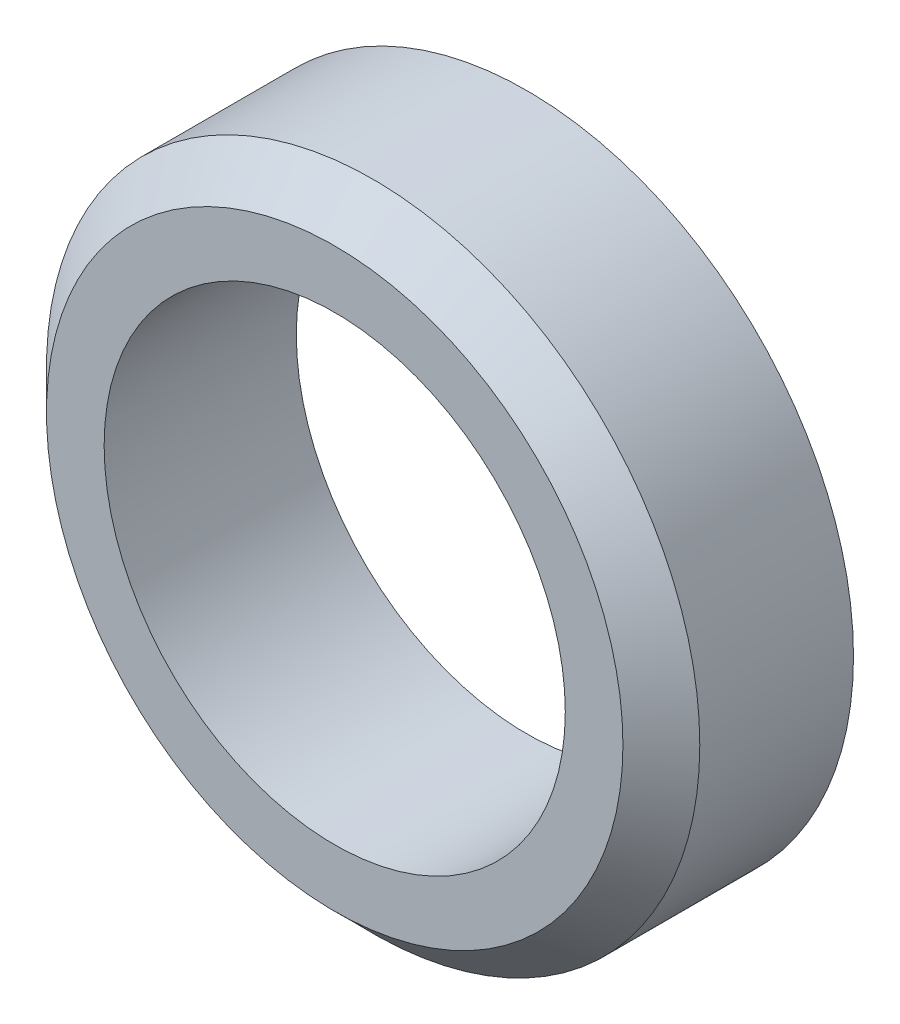
ISO-10303-21;
HEADER;
FILE_DESCRIPTION(('STEP AP214'),'2;1');
FILE_NAME('part.step','',(''),(''),'','','');
FILE_SCHEMA(('AUTOMOTIVE_DESIGN { 1 0 10303 214 1 1 1 1 }'));
ENDSEC;
DATA;
#1=APPLICATION_CONTEXT('core data for automotive mechanical design processes');
#2=APPLICATION_PROTOCOL_DEFINITION('international standard','automotive_design',2000,#1);
#3=PRODUCT_CONTEXT('',#1,'mechanical');
#4=PRODUCT('Part','Part','',(#3));
#5=PRODUCT_RELATED_PRODUCT_CATEGORY('part','',(#4));
#6=PRODUCT_DEFINITION_FORMATION('','',#4);
#7=PRODUCT_DEFINITION_CONTEXT('part definition',#1,'design');
#8=PRODUCT_DEFINITION('design','',#6,#7);
#9=PRODUCT_DEFINITION_SHAPE('','',#8);
#10=(LENGTH_UNIT() NAMED_UNIT(*) SI_UNIT(.MILLI.,.METRE.));
#11=(NAMED_UNIT(*) PLANE_ANGLE_UNIT() SI_UNIT($,.RADIAN.));
#12=(NAMED_UNIT(*) SI_UNIT($,.STERADIAN.) SOLID_ANGLE_UNIT());
#13=UNCERTAINTY_MEASURE_WITH_UNIT(LENGTH_MEASURE(1.E-05),#10,'distance_accuracy_value','');
#14=(GEOMETRIC_REPRESENTATION_CONTEXT(3) GLOBAL_UNCERTAINTY_ASSIGNED_CONTEXT((#13)) GLOBAL_UNIT_ASSIGNED_CONTEXT((#10,
#11,#12)) REPRESENTATION_CONTEXT('',''));
#15=CARTESIAN_POINT('',(0.,0.,0.));
#16=DIRECTION('',(0.,0.,1.));
#17=DIRECTION('',(1.,0.,0.));
#18=AXIS2_PLACEMENT_3D('',#15,#16,#17);
#19=CARTESIAN_POINT('',(0.,0.,25.));
#20=DIRECTION('',(0.,0.,-1.));
#21=DIRECTION('',(-1.,0.,0.));
#22=AXIS2_PLACEMENT_3D('',#19,#20,#21);
#23=CYLINDRICAL_SURFACE('',#22,42.5);
#24=CARTESIAN_POINT('',(0.,0.,20.));
#25=DIRECTION('',(0.,0.,1.));
#26=DIRECTION('',(1.,0.,0.));
#27=AXIS2_PLACEMENT_3D('',#24,#25,#26);
#28=CIRCLE('',#27,42.5);
#29=CARTESIAN_POINT('',(42.5,0.,20.));
#30=VERTEX_POINT('',#29);
#31=EDGE_CURVE('E10',#30,#30,#28,.F.);
#32=ORIENTED_EDGE('',*,*,#31,.T.);
#33=EDGE_LOOP('',(#32));
#34=FACE_BOUND('',#33,.T.);
#35=CARTESIAN_POINT('',(0.,0.,0.));
#36=DIRECTION('',(0.,0.,1.));
#37=DIRECTION('',(1.,0.,0.));
#38=AXIS2_PLACEMENT_3D('',#35,#36,#37);
#39=CIRCLE('',#38,42.5);
#40=CARTESIAN_POINT('',(42.5,0.,0.));
#41=VERTEX_POINT('',#40);
#42=EDGE_CURVE('E44',#41,#41,#39,.T.);
#43=ORIENTED_EDGE('',*,*,#42,.T.);
#44=EDGE_LOOP('',(#43));
#45=FACE_BOUND('',#44,.T.);
#46=ADVANCED_FACE('F33',(#34,#45),#23,.T.);
#47=CARTESIAN_POINT('',(0.,0.,25.));
#48=DIRECTION('',(0.,0.,1.));
#49=DIRECTION('',(1.,0.,0.));
#50=AXIS2_PLACEMENT_3D('',#47,#48,#49);
#51=PLANE('',#50);
#52=CARTESIAN_POINT('',(0.,0.,25.));
#53=DIRECTION('',(0.,0.,-1.));
#54=DIRECTION('',(-1.,0.,0.));
#55=AXIS2_PLACEMENT_3D('',#52,#53,#54);
#56=CIRCLE('',#55,30.);
#57=CARTESIAN_POINT('',(-30.,0.,25.));
#58=VERTEX_POINT('',#57);
#59=EDGE_CURVE('E48',#58,#58,#56,.T.);
#60=ORIENTED_EDGE('',*,*,#59,.T.);
#61=EDGE_LOOP('',(#60));
#62=FACE_BOUND('',#61,.T.);
#63=CARTESIAN_POINT('',(0.,0.,25.));
#64=DIRECTION('',(0.,0.,1.));
#65=DIRECTION('',(1.,0.,0.));
#66=AXIS2_PLACEMENT_3D('',#63,#64,#65);
#67=CIRCLE('',#66,37.5);
#68=CARTESIAN_POINT('',(37.5,0.,25.));
#69=VERTEX_POINT('',#68);
#70=EDGE_CURVE('E40',#69,#69,#67,.T.);
#71=ORIENTED_EDGE('',*,*,#70,.T.);
#72=EDGE_LOOP('',(#71));
#73=FACE_BOUND('',#72,.T.);
#74=ADVANCED_FACE('F57',(#62,#73),#51,.T.);
#75=CARTESIAN_POINT('',(0.,0.,0.));
#76=DIRECTION('',(0.,0.,1.));
#77=DIRECTION('',(1.,0.,0.));
#78=AXIS2_PLACEMENT_3D('',#75,#76,#77);
#79=PLANE('',#78);
#80=CARTESIAN_POINT('',(0.,0.,0.));
#81=DIRECTION('',(0.,0.,-1.));
#82=DIRECTION('',(-1.,0.,0.));
#83=AXIS2_PLACEMENT_3D('',#80,#81,#82);
#84=CIRCLE('',#83,30.);
#85=CARTESIAN_POINT('',(-30.,0.,0.));
#86=VERTEX_POINT('',#85);
#87=EDGE_CURVE('E51',#86,#86,#84,.T.);
#88=ORIENTED_EDGE('',*,*,#87,.F.);
#89=EDGE_LOOP('',(#88));
#90=FACE_BOUND('',#89,.T.);
#91=ORIENTED_EDGE('',*,*,#42,.F.);
#92=EDGE_LOOP('',(#91));
#93=FACE_BOUND('',#92,.T.);
#94=ADVANCED_FACE('F65',(#90,#93),#79,.F.);
#95=CARTESIAN_POINT('',(0.,0.,25.));
#96=DIRECTION('',(0.,0.,-1.));
#97=DIRECTION('',(-1.,0.,0.));
#98=AXIS2_PLACEMENT_3D('',#95,#96,#97);
#99=CONICAL_SURFACE('',#98,37.5,0.785398163397448);
#100=ORIENTED_EDGE('',*,*,#31,.F.);
#101=EDGE_LOOP('',(#100));
#102=FACE_BOUND('',#101,.T.);
#103=ORIENTED_EDGE('',*,*,#70,.F.);
#104=EDGE_LOOP('',(#103));
#105=FACE_BOUND('',#104,.T.);
#106=ADVANCED_FACE('F35',(#102,#105),#99,.T.);
#107=CARTESIAN_POINT('',(0.,0.,25.));
#108=DIRECTION('',(0.,0.,-1.));
#109=DIRECTION('',(-1.,0.,0.));
#110=AXIS2_PLACEMENT_3D('',#107,#108,#109);
#111=CYLINDRICAL_SURFACE('',#110,30.);
#112=ORIENTED_EDGE('',*,*,#59,.F.);
#113=EDGE_LOOP('',(#112));
#114=FACE_BOUND('',#113,.T.);
#115=ORIENTED_EDGE('',*,*,#87,.T.);
#116=EDGE_LOOP('',(#115));
#117=FACE_BOUND('',#116,.T.);
#118=ADVANCED_FACE('F59',(#114,#117),#111,.F.);
#119=CLOSED_SHELL('',(#46,#74,#94,#106,#118));
#120=MANIFOLD_SOLID_BREP('B2',#119);
#121=ADVANCED_BREP_SHAPE_REPRESENTATION('',(#18,#120),#14);
#122=SHAPE_DEFINITION_REPRESENTATION(#9,#121);
ENDSEC;
END-ISO-10303-21;
